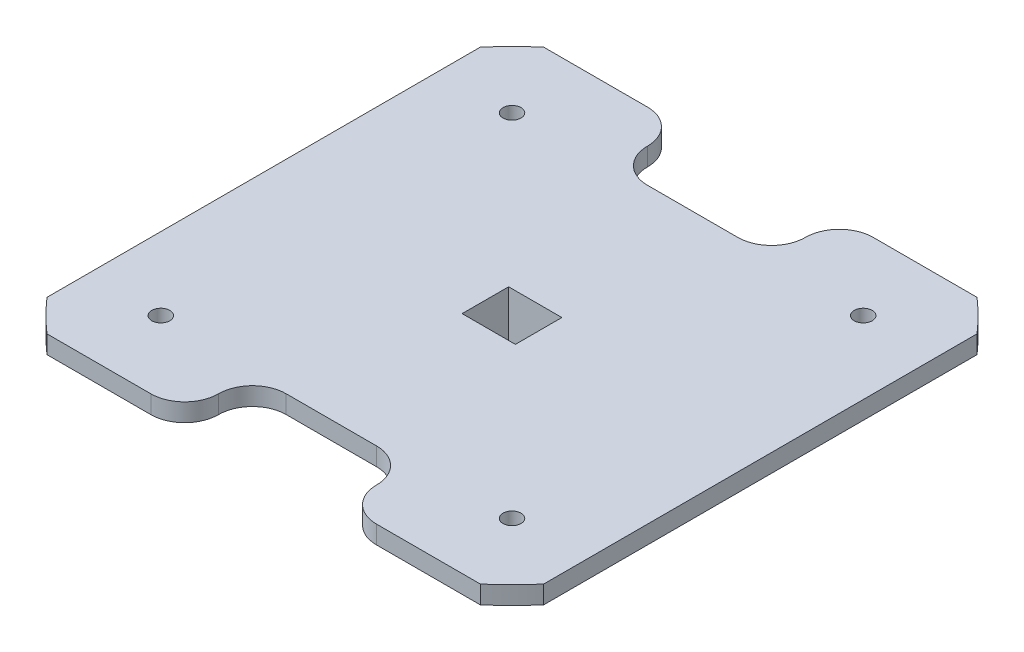
ISO-10303-21;
HEADER;
FILE_DESCRIPTION(('STEP AP214'),'2;1');
FILE_NAME('part.step','',(''),(''),'','','');
FILE_SCHEMA(('AUTOMOTIVE_DESIGN { 1 0 10303 214 1 1 1 1 }'));
ENDSEC;
DATA;
#1=APPLICATION_CONTEXT('core data for automotive mechanical design processes');
#2=APPLICATION_PROTOCOL_DEFINITION('international standard','automotive_design',2000,#1);
#3=PRODUCT_CONTEXT('',#1,'mechanical');
#4=PRODUCT('Part','Part','',(#3));
#5=PRODUCT_RELATED_PRODUCT_CATEGORY('part','',(#4));
#6=PRODUCT_DEFINITION_FORMATION('','',#4);
#7=PRODUCT_DEFINITION_CONTEXT('part definition',#1,'design');
#8=PRODUCT_DEFINITION('design','',#6,#7);
#9=PRODUCT_DEFINITION_SHAPE('','',#8);
#10=(LENGTH_UNIT() NAMED_UNIT(*) SI_UNIT(.MILLI.,.METRE.));
#11=(NAMED_UNIT(*) PLANE_ANGLE_UNIT() SI_UNIT($,.RADIAN.));
#12=(NAMED_UNIT(*) SI_UNIT($,.STERADIAN.) SOLID_ANGLE_UNIT());
#13=UNCERTAINTY_MEASURE_WITH_UNIT(LENGTH_MEASURE(1.E-05),#10,'distance_accuracy_value','');
#14=(GEOMETRIC_REPRESENTATION_CONTEXT(3) GLOBAL_UNCERTAINTY_ASSIGNED_CONTEXT((#13)) GLOBAL_UNIT_ASSIGNED_CONTEXT((#10,
#11,#12)) REPRESENTATION_CONTEXT('',''));
#15=CARTESIAN_POINT('',(0.,0.,0.));
#16=DIRECTION('',(0.,0.,1.));
#17=DIRECTION('',(1.,0.,0.));
#18=AXIS2_PLACEMENT_3D('',#15,#16,#17);
#19=CARTESIAN_POINT('',(0.,4.,0.));
#20=DIRECTION('',(0.,1.,0.));
#21=DIRECTION('',(0.,0.,1.));
#22=AXIS2_PLACEMENT_3D('',#19,#20,#21);
#23=PLANE('',#22);
#24=CARTESIAN_POINT('',(38.8908729652599,4.,-38.8908729652603));
#25=DIRECTION('',(0.,1.,0.));
#26=DIRECTION('',(0.,0.,1.));
#27=AXIS2_PLACEMENT_3D('',#24,#25,#26);
#28=CIRCLE('',#27,1.99999999999999);
#29=CARTESIAN_POINT('',(38.8908729652599,4.,-36.8908729652603));
#30=VERTEX_POINT('',#29);
#31=EDGE_CURVE('E272',#30,#30,#28,.T.);
#32=ORIENTED_EDGE('',*,*,#31,.F.);
#33=EDGE_LOOP('',(#32));
#34=FACE_BOUND('',#33,.T.);
#35=CARTESIAN_POINT('',(38.8908729652603,4.,38.8908729652599));
#36=DIRECTION('',(0.,1.,0.));
#37=DIRECTION('',(0.,0.,1.));
#38=AXIS2_PLACEMENT_3D('',#35,#36,#37);
#39=CIRCLE('',#38,1.99999999999999);
#40=CARTESIAN_POINT('',(38.8908729652603,4.,40.8908729652599));
#41=VERTEX_POINT('',#40);
#42=EDGE_CURVE('E482',#41,#41,#39,.T.);
#43=ORIENTED_EDGE('',*,*,#42,.F.);
#44=EDGE_LOOP('',(#43));
#45=FACE_BOUND('',#44,.T.);
#46=CARTESIAN_POINT('',(-38.8908729652599,4.,38.8908729652603));
#47=DIRECTION('',(0.,1.,0.));
#48=DIRECTION('',(0.,0.,1.));
#49=AXIS2_PLACEMENT_3D('',#46,#47,#48);
#50=CIRCLE('',#49,1.99999999999999);
#51=CARTESIAN_POINT('',(-38.8908729652599,4.,40.8908729652603));
#52=VERTEX_POINT('',#51);
#53=EDGE_CURVE('E474',#52,#52,#50,.T.);
#54=ORIENTED_EDGE('',*,*,#53,.F.);
#55=EDGE_LOOP('',(#54));
#56=FACE_BOUND('',#55,.T.);
#57=CARTESIAN_POINT('',(-38.8908729652603,4.,-38.8908729652599));
#58=DIRECTION('',(0.,1.,0.));
#59=DIRECTION('',(0.,0.,1.));
#60=AXIS2_PLACEMENT_3D('',#57,#58,#59);
#61=CIRCLE('',#60,1.99999999999999);
#62=CARTESIAN_POINT('',(-38.8908729652603,4.,-36.8908729652599));
#63=VERTEX_POINT('',#62);
#64=EDGE_CURVE('E466',#63,#63,#61,.T.);
#65=ORIENTED_EDGE('',*,*,#64,.F.);
#66=EDGE_LOOP('',(#65));
#67=FACE_BOUND('',#66,.T.);
#68=DIRECTION('',(-1.,0.,0.));
#69=VECTOR('',#68,1.);
#70=CARTESIAN_POINT('',(17.5,4.,-55.));
#71=LINE('',#70,#69);
#72=CARTESIAN_POINT('',(48.,4.,-55.));
#73=VERTEX_POINT('',#72);
#74=CARTESIAN_POINT('',(25.,4.,-55.));
#75=VERTEX_POINT('',#74);
#76=EDGE_CURVE('E450',#73,#75,#71,.T.);
#77=ORIENTED_EDGE('',*,*,#76,.T.);
#78=CARTESIAN_POINT('',(25.,4.,-47.5));
#79=DIRECTION('',(0.,1.,0.));
#80=DIRECTION('',(0.,0.,1.));
#81=AXIS2_PLACEMENT_3D('',#78,#79,#80);
#82=CIRCLE('',#81,7.5);
#83=CARTESIAN_POINT('',(17.5,4.,-47.5));
#84=VERTEX_POINT('',#83);
#85=EDGE_CURVE('E320',#75,#84,#82,.T.);
#86=ORIENTED_EDGE('',*,*,#85,.T.);
#87=CARTESIAN_POINT('',(10.,4.,-47.5));
#88=DIRECTION('',(0.,1.,0.));
#89=DIRECTION('',(0.,0.,1.));
#90=AXIS2_PLACEMENT_3D('',#87,#88,#89);
#91=CIRCLE('',#90,7.5);
#92=CARTESIAN_POINT('',(10.,4.,-40.));
#93=VERTEX_POINT('',#92);
#94=EDGE_CURVE('E290',#84,#93,#91,.F.);
#95=ORIENTED_EDGE('',*,*,#94,.T.);
#96=DIRECTION('',(-1.,0.,0.));
#97=VECTOR('',#96,1.);
#98=CARTESIAN_POINT('',(-17.5,4.,-40.));
#99=LINE('',#98,#97);
#100=CARTESIAN_POINT('',(-10.,4.,-40.));
#101=VERTEX_POINT('',#100);
#102=EDGE_CURVE('E446',#93,#101,#99,.T.);
#103=ORIENTED_EDGE('',*,*,#102,.T.);
#104=CARTESIAN_POINT('',(-10.,4.,-47.5));
#105=DIRECTION('',(0.,1.,0.));
#106=DIRECTION('',(0.,0.,1.));
#107=AXIS2_PLACEMENT_3D('',#104,#105,#106);
#108=CIRCLE('',#107,7.5);
#109=CARTESIAN_POINT('',(-17.5,4.,-47.5));
#110=VERTEX_POINT('',#109);
#111=EDGE_CURVE('E284',#101,#110,#108,.F.);
#112=ORIENTED_EDGE('',*,*,#111,.T.);
#113=CARTESIAN_POINT('',(-25.,4.,-47.5));
#114=DIRECTION('',(0.,1.,0.));
#115=DIRECTION('',(0.,0.,1.));
#116=AXIS2_PLACEMENT_3D('',#113,#114,#115);
#117=CIRCLE('',#116,7.5);
#118=CARTESIAN_POINT('',(-25.,4.,-55.));
#119=VERTEX_POINT('',#118);
#120=EDGE_CURVE('E323',#110,#119,#117,.T.);
#121=ORIENTED_EDGE('',*,*,#120,.T.);
#122=DIRECTION('',(-1.,0.,0.));
#123=VECTOR('',#122,1.);
#124=CARTESIAN_POINT('',(-48.,4.,-55.));
#125=LINE('',#124,#123);
#126=CARTESIAN_POINT('',(-48.,4.,-55.));
#127=VERTEX_POINT('',#126);
#128=EDGE_CURVE('E443',#119,#127,#125,.T.);
#129=ORIENTED_EDGE('',*,*,#128,.T.);
#130=CARTESIAN_POINT('',(0.,4.,0.));
#131=DIRECTION('',(0.,1.,0.));
#132=DIRECTION('',(0.,0.,1.));
#133=AXIS2_PLACEMENT_3D('',#130,#131,#132);
#134=CIRCLE('',#133,73.);
#135=CARTESIAN_POINT('',(-55.,4.,-48.));
#136=VERTEX_POINT('',#135);
#137=EDGE_CURVE('E440',#127,#136,#134,.T.);
#138=ORIENTED_EDGE('',*,*,#137,.T.);
#139=DIRECTION('',(0.,0.,1.));
#140=VECTOR('',#139,1.);
#141=CARTESIAN_POINT('',(-55.,4.,48.));
#142=LINE('',#141,#140);
#143=CARTESIAN_POINT('',(-55.,4.,48.));
#144=VERTEX_POINT('',#143);
#145=EDGE_CURVE('E437',#136,#144,#142,.T.);
#146=ORIENTED_EDGE('',*,*,#145,.T.);
#147=CARTESIAN_POINT('',(0.,4.,0.));
#148=DIRECTION('',(0.,1.,0.));
#149=DIRECTION('',(0.,0.,1.));
#150=AXIS2_PLACEMENT_3D('',#147,#148,#149);
#151=CIRCLE('',#150,73.);
#152=CARTESIAN_POINT('',(-48.,4.,55.));
#153=VERTEX_POINT('',#152);
#154=EDGE_CURVE('E434',#144,#153,#151,.T.);
#155=ORIENTED_EDGE('',*,*,#154,.T.);
#156=DIRECTION('',(1.,0.,0.));
#157=VECTOR('',#156,1.);
#158=CARTESIAN_POINT('',(-17.5,4.,55.));
#159=LINE('',#158,#157);
#160=CARTESIAN_POINT('',(-25.,4.,55.));
#161=VERTEX_POINT('',#160);
#162=EDGE_CURVE('E430',#153,#161,#159,.T.);
#163=ORIENTED_EDGE('',*,*,#162,.T.);
#164=CARTESIAN_POINT('',(-25.,4.,47.5));
#165=DIRECTION('',(0.,1.,0.));
#166=DIRECTION('',(0.,0.,1.));
#167=AXIS2_PLACEMENT_3D('',#164,#165,#166);
#168=CIRCLE('',#167,7.5);
#169=CARTESIAN_POINT('',(-17.5,4.,47.5));
#170=VERTEX_POINT('',#169);
#171=EDGE_CURVE('E326',#161,#170,#168,.T.);
#172=ORIENTED_EDGE('',*,*,#171,.T.);
#173=CARTESIAN_POINT('',(-10.,4.,47.5));
#174=DIRECTION('',(0.,1.,0.));
#175=DIRECTION('',(0.,0.,1.));
#176=AXIS2_PLACEMENT_3D('',#173,#174,#175);
#177=CIRCLE('',#176,7.5);
#178=CARTESIAN_POINT('',(-10.,4.,40.));
#179=VERTEX_POINT('',#178);
#180=EDGE_CURVE('E278',#170,#179,#177,.F.);
#181=ORIENTED_EDGE('',*,*,#180,.T.);
#182=DIRECTION('',(1.,0.,0.));
#183=VECTOR('',#182,1.);
#184=CARTESIAN_POINT('',(-17.5,4.,40.));
#185=LINE('',#184,#183);
#186=CARTESIAN_POINT('',(10.,4.,40.));
#187=VERTEX_POINT('',#186);
#188=EDGE_CURVE('E426',#179,#187,#185,.T.);
#189=ORIENTED_EDGE('',*,*,#188,.T.);
#190=CARTESIAN_POINT('',(10.,4.,47.5));
#191=DIRECTION('',(0.,1.,0.));
#192=DIRECTION('',(0.,0.,1.));
#193=AXIS2_PLACEMENT_3D('',#190,#191,#192);
#194=CIRCLE('',#193,7.5);
#195=CARTESIAN_POINT('',(17.5,4.,47.5));
#196=VERTEX_POINT('',#195);
#197=EDGE_CURVE('E248',#187,#196,#194,.F.);
#198=ORIENTED_EDGE('',*,*,#197,.T.);
#199=CARTESIAN_POINT('',(25.,4.,47.5));
#200=DIRECTION('',(0.,1.,0.));
#201=DIRECTION('',(0.,0.,1.));
#202=AXIS2_PLACEMENT_3D('',#199,#200,#201);
#203=CIRCLE('',#202,7.5);
#204=CARTESIAN_POINT('',(25.,4.,55.));
#205=VERTEX_POINT('',#204);
#206=EDGE_CURVE('E329',#196,#205,#203,.T.);
#207=ORIENTED_EDGE('',*,*,#206,.T.);
#208=DIRECTION('',(1.,0.,0.));
#209=VECTOR('',#208,1.);
#210=CARTESIAN_POINT('',(48.,4.,55.));
#211=LINE('',#210,#209);
#212=CARTESIAN_POINT('',(48.,4.,55.));
#213=VERTEX_POINT('',#212);
#214=EDGE_CURVE('E380',#205,#213,#211,.T.);
#215=ORIENTED_EDGE('',*,*,#214,.T.);
#216=CARTESIAN_POINT('',(0.,4.,0.));
#217=DIRECTION('',(0.,1.,0.));
#218=DIRECTION('',(0.,0.,1.));
#219=AXIS2_PLACEMENT_3D('',#216,#217,#218);
#220=CIRCLE('',#219,73.);
#221=CARTESIAN_POINT('',(55.,4.,48.));
#222=VERTEX_POINT('',#221);
#223=EDGE_CURVE('E384',#213,#222,#220,.T.);
#224=ORIENTED_EDGE('',*,*,#223,.T.);
#225=DIRECTION('',(0.,0.,-1.));
#226=VECTOR('',#225,1.);
#227=CARTESIAN_POINT('',(55.,4.,-48.));
#228=LINE('',#227,#226);
#229=CARTESIAN_POINT('',(55.,4.,-48.));
#230=VERTEX_POINT('',#229);
#231=EDGE_CURVE('E457',#222,#230,#228,.T.);
#232=ORIENTED_EDGE('',*,*,#231,.T.);
#233=CARTESIAN_POINT('',(0.,4.,0.));
#234=DIRECTION('',(0.,1.,0.));
#235=DIRECTION('',(0.,0.,1.));
#236=AXIS2_PLACEMENT_3D('',#233,#234,#235);
#237=CIRCLE('',#236,73.);
#238=EDGE_CURVE('E454',#230,#73,#237,.T.);
#239=ORIENTED_EDGE('',*,*,#238,.T.);
#240=EDGE_LOOP('',(#77,#86,#95,#103,#112,#121,#129,#138,#146,#155,#163,#172,#181,#189,#198,#207,
#215,#224,#232,#239));
#241=FACE_BOUND('',#240,.T.);
#242=DIRECTION('',(-1.,0.,0.));
#243=VECTOR('',#242,1.);
#244=CARTESIAN_POINT('',(0.,4.,5.15));
#245=LINE('',#244,#243);
#246=CARTESIAN_POINT('',(5.9,4.,5.15));
#247=VERTEX_POINT('',#246);
#248=CARTESIAN_POINT('',(-5.9,4.,5.15));
#249=VERTEX_POINT('',#248);
#250=EDGE_CURVE('E55',#247,#249,#245,.T.);
#251=ORIENTED_EDGE('',*,*,#250,.T.);
#252=DIRECTION('',(0.,0.,-1.));
#253=VECTOR('',#252,1.);
#254=CARTESIAN_POINT('',(-5.9,4.,0.));
#255=LINE('',#254,#253);
#256=CARTESIAN_POINT('',(-5.9,4.,-5.15));
#257=VERTEX_POINT('',#256);
#258=EDGE_CURVE('E11',#249,#257,#255,.T.);
#259=ORIENTED_EDGE('',*,*,#258,.T.);
#260=DIRECTION('',(-1.,0.,0.));
#261=VECTOR('',#260,1.);
#262=CARTESIAN_POINT('',(0.,4.,-5.15));
#263=LINE('',#262,#261);
#264=CARTESIAN_POINT('',(5.9,4.,-5.15));
#265=VERTEX_POINT('',#264);
#266=EDGE_CURVE('E243',#265,#257,#263,.T.);
#267=ORIENTED_EDGE('',*,*,#266,.F.);
#268=DIRECTION('',(0.,0.,-1.));
#269=VECTOR('',#268,1.);
#270=CARTESIAN_POINT('',(5.9,4.,0.));
#271=LINE('',#270,#269);
#272=EDGE_CURVE('E247',#247,#265,#271,.T.);
#273=ORIENTED_EDGE('',*,*,#272,.F.);
#274=EDGE_LOOP('',(#251,#259,#267,#273));
#275=FACE_BOUND('',#274,.T.);
#276=ADVANCED_FACE('F47',(#34,#45,#56,#67,#241,#275),#23,.T.);
#277=CARTESIAN_POINT('',(0.,0.,0.));
#278=DIRECTION('',(0.,1.,0.));
#279=DIRECTION('',(0.,0.,1.));
#280=AXIS2_PLACEMENT_3D('',#277,#278,#279);
#281=PLANE('',#280);
#282=CARTESIAN_POINT('',(38.8908729652599,0.,-38.8908729652603));
#283=DIRECTION('',(0.,1.,0.));
#284=DIRECTION('',(0.,0.,1.));
#285=AXIS2_PLACEMENT_3D('',#282,#283,#284);
#286=CIRCLE('',#285,2.);
#287=CARTESIAN_POINT('',(38.8908729652599,0.,-36.8908729652603));
#288=VERTEX_POINT('',#287);
#289=EDGE_CURVE('E486',#288,#288,#286,.T.);
#290=ORIENTED_EDGE('',*,*,#289,.T.);
#291=EDGE_LOOP('',(#290));
#292=FACE_BOUND('',#291,.T.);
#293=CARTESIAN_POINT('',(38.8908729652603,0.,38.8908729652599));
#294=DIRECTION('',(0.,1.,0.));
#295=DIRECTION('',(0.,0.,1.));
#296=AXIS2_PLACEMENT_3D('',#293,#294,#295);
#297=CIRCLE('',#296,2.);
#298=CARTESIAN_POINT('',(38.8908729652603,0.,40.8908729652599));
#299=VERTEX_POINT('',#298);
#300=EDGE_CURVE('E478',#299,#299,#297,.T.);
#301=ORIENTED_EDGE('',*,*,#300,.T.);
#302=EDGE_LOOP('',(#301));
#303=FACE_BOUND('',#302,.T.);
#304=CARTESIAN_POINT('',(-38.8908729652599,0.,38.8908729652603));
#305=DIRECTION('',(0.,1.,0.));
#306=DIRECTION('',(0.,0.,1.));
#307=AXIS2_PLACEMENT_3D('',#304,#305,#306);
#308=CIRCLE('',#307,2.);
#309=CARTESIAN_POINT('',(-38.8908729652599,0.,40.8908729652603));
#310=VERTEX_POINT('',#309);
#311=EDGE_CURVE('E470',#310,#310,#308,.T.);
#312=ORIENTED_EDGE('',*,*,#311,.T.);
#313=EDGE_LOOP('',(#312));
#314=FACE_BOUND('',#313,.T.);
#315=CARTESIAN_POINT('',(-38.8908729652603,0.,-38.8908729652599));
#316=DIRECTION('',(0.,1.,0.));
#317=DIRECTION('',(0.,0.,1.));
#318=AXIS2_PLACEMENT_3D('',#315,#316,#317);
#319=CIRCLE('',#318,2.);
#320=CARTESIAN_POINT('',(-38.8908729652603,0.,-36.8908729652599));
#321=VERTEX_POINT('',#320);
#322=EDGE_CURVE('E423',#321,#321,#319,.T.);
#323=ORIENTED_EDGE('',*,*,#322,.T.);
#324=EDGE_LOOP('',(#323));
#325=FACE_BOUND('',#324,.T.);
#326=DIRECTION('',(-1.,0.,0.));
#327=VECTOR('',#326,1.);
#328=CARTESIAN_POINT('',(-17.5,0.,-40.));
#329=LINE('',#328,#327);
#330=CARTESIAN_POINT('',(10.,0.,-40.));
#331=VERTEX_POINT('',#330);
#332=CARTESIAN_POINT('',(-10.,0.,-40.));
#333=VERTEX_POINT('',#332);
#334=EDGE_CURVE('E405',#331,#333,#329,.T.);
#335=ORIENTED_EDGE('',*,*,#334,.F.);
#336=CARTESIAN_POINT('',(10.,0.,-47.5));
#337=DIRECTION('',(0.,1.,0.));
#338=DIRECTION('',(0.,0.,1.));
#339=AXIS2_PLACEMENT_3D('',#336,#337,#338);
#340=CIRCLE('',#339,7.5);
#341=CARTESIAN_POINT('',(17.5,0.,-47.5));
#342=VERTEX_POINT('',#341);
#343=EDGE_CURVE('E293',#331,#342,#340,.T.);
#344=ORIENTED_EDGE('',*,*,#343,.T.);
#345=CARTESIAN_POINT('',(25.,0.,-47.5));
#346=DIRECTION('',(0.,1.,0.));
#347=DIRECTION('',(0.,0.,1.));
#348=AXIS2_PLACEMENT_3D('',#345,#346,#347);
#349=CIRCLE('',#348,7.5);
#350=CARTESIAN_POINT('',(25.,0.,-55.));
#351=VERTEX_POINT('',#350);
#352=EDGE_CURVE('E336',#342,#351,#349,.F.);
#353=ORIENTED_EDGE('',*,*,#352,.T.);
#354=DIRECTION('',(-1.,0.,0.));
#355=VECTOR('',#354,1.);
#356=CARTESIAN_POINT('',(17.5,0.,-55.));
#357=LINE('',#356,#355);
#358=CARTESIAN_POINT('',(48.,0.,-55.));
#359=VERTEX_POINT('',#358);
#360=EDGE_CURVE('E409',#359,#351,#357,.T.);
#361=ORIENTED_EDGE('',*,*,#360,.F.);
#362=CARTESIAN_POINT('',(0.,0.,0.));
#363=DIRECTION('',(0.,1.,0.));
#364=DIRECTION('',(0.,0.,1.));
#365=AXIS2_PLACEMENT_3D('',#362,#363,#364);
#366=CIRCLE('',#365,73.);
#367=CARTESIAN_POINT('',(55.,0.,-48.));
#368=VERTEX_POINT('',#367);
#369=EDGE_CURVE('E413',#368,#359,#366,.T.);
#370=ORIENTED_EDGE('',*,*,#369,.F.);
#371=DIRECTION('',(0.,0.,-1.));
#372=VECTOR('',#371,1.);
#373=CARTESIAN_POINT('',(55.,0.,-48.));
#374=LINE('',#373,#372);
#375=CARTESIAN_POINT('',(55.,0.,48.));
#376=VERTEX_POINT('',#375);
#377=EDGE_CURVE('E416',#376,#368,#374,.T.);
#378=ORIENTED_EDGE('',*,*,#377,.F.);
#379=CARTESIAN_POINT('',(0.,0.,0.));
#380=DIRECTION('',(0.,1.,0.));
#381=DIRECTION('',(0.,0.,1.));
#382=AXIS2_PLACEMENT_3D('',#379,#380,#381);
#383=CIRCLE('',#382,73.);
#384=CARTESIAN_POINT('',(48.,0.,55.));
#385=VERTEX_POINT('',#384);
#386=EDGE_CURVE('E419',#385,#376,#383,.T.);
#387=ORIENTED_EDGE('',*,*,#386,.F.);
#388=DIRECTION('',(1.,0.,0.));
#389=VECTOR('',#388,1.);
#390=CARTESIAN_POINT('',(48.,0.,55.));
#391=LINE('',#390,#389);
#392=CARTESIAN_POINT('',(25.,0.,55.));
#393=VERTEX_POINT('',#392);
#394=EDGE_CURVE('E381',#393,#385,#391,.T.);
#395=ORIENTED_EDGE('',*,*,#394,.F.);
#396=CARTESIAN_POINT('',(25.,0.,47.5));
#397=DIRECTION('',(0.,1.,0.));
#398=DIRECTION('',(0.,0.,1.));
#399=AXIS2_PLACEMENT_3D('',#396,#397,#398);
#400=CIRCLE('',#399,7.5);
#401=CARTESIAN_POINT('',(17.5,0.,47.5));
#402=VERTEX_POINT('',#401);
#403=EDGE_CURVE('E345',#393,#402,#400,.F.);
#404=ORIENTED_EDGE('',*,*,#403,.T.);
#405=CARTESIAN_POINT('',(10.,0.,47.5));
#406=DIRECTION('',(0.,1.,0.));
#407=DIRECTION('',(0.,0.,1.));
#408=AXIS2_PLACEMENT_3D('',#405,#406,#407);
#409=CIRCLE('',#408,7.5);
#410=CARTESIAN_POINT('',(10.,0.,40.));
#411=VERTEX_POINT('',#410);
#412=EDGE_CURVE('E275',#402,#411,#409,.T.);
#413=ORIENTED_EDGE('',*,*,#412,.T.);
#414=DIRECTION('',(1.,0.,0.));
#415=VECTOR('',#414,1.);
#416=CARTESIAN_POINT('',(-17.5,0.,40.));
#417=LINE('',#416,#415);
#418=CARTESIAN_POINT('',(-10.,0.,40.));
#419=VERTEX_POINT('',#418);
#420=EDGE_CURVE('E385',#419,#411,#417,.T.);
#421=ORIENTED_EDGE('',*,*,#420,.F.);
#422=CARTESIAN_POINT('',(-10.,0.,47.5));
#423=DIRECTION('',(0.,1.,0.));
#424=DIRECTION('',(0.,0.,1.));
#425=AXIS2_PLACEMENT_3D('',#422,#423,#424);
#426=CIRCLE('',#425,7.5);
#427=CARTESIAN_POINT('',(-17.5,0.,47.5));
#428=VERTEX_POINT('',#427);
#429=EDGE_CURVE('E281',#419,#428,#426,.T.);
#430=ORIENTED_EDGE('',*,*,#429,.T.);
#431=CARTESIAN_POINT('',(-25.,0.,47.5));
#432=DIRECTION('',(0.,1.,0.));
#433=DIRECTION('',(0.,0.,1.));
#434=AXIS2_PLACEMENT_3D('',#431,#432,#433);
#435=CIRCLE('',#434,7.5);
#436=CARTESIAN_POINT('',(-25.,0.,55.));
#437=VERTEX_POINT('',#436);
#438=EDGE_CURVE('E342',#428,#437,#435,.F.);
#439=ORIENTED_EDGE('',*,*,#438,.T.);
#440=DIRECTION('',(1.,0.,0.));
#441=VECTOR('',#440,1.);
#442=CARTESIAN_POINT('',(-17.5,0.,55.));
#443=LINE('',#442,#441);
#444=CARTESIAN_POINT('',(-48.,0.,55.));
#445=VERTEX_POINT('',#444);
#446=EDGE_CURVE('E389',#445,#437,#443,.T.);
#447=ORIENTED_EDGE('',*,*,#446,.F.);
#448=CARTESIAN_POINT('',(0.,0.,0.));
#449=DIRECTION('',(0.,1.,0.));
#450=DIRECTION('',(0.,0.,1.));
#451=AXIS2_PLACEMENT_3D('',#448,#449,#450);
#452=CIRCLE('',#451,73.);
#453=CARTESIAN_POINT('',(-55.,0.,48.));
#454=VERTEX_POINT('',#453);
#455=EDGE_CURVE('E393',#454,#445,#452,.T.);
#456=ORIENTED_EDGE('',*,*,#455,.F.);
#457=DIRECTION('',(0.,0.,1.));
#458=VECTOR('',#457,1.);
#459=CARTESIAN_POINT('',(-55.,0.,48.));
#460=LINE('',#459,#458);
#461=CARTESIAN_POINT('',(-55.,0.,-48.));
#462=VERTEX_POINT('',#461);
#463=EDGE_CURVE('E396',#462,#454,#460,.T.);
#464=ORIENTED_EDGE('',*,*,#463,.F.);
#465=CARTESIAN_POINT('',(0.,0.,0.));
#466=DIRECTION('',(0.,1.,0.));
#467=DIRECTION('',(0.,0.,1.));
#468=AXIS2_PLACEMENT_3D('',#465,#466,#467);
#469=CIRCLE('',#468,73.);
#470=CARTESIAN_POINT('',(-48.,0.,-55.));
#471=VERTEX_POINT('',#470);
#472=EDGE_CURVE('E399',#471,#462,#469,.T.);
#473=ORIENTED_EDGE('',*,*,#472,.F.);
#474=DIRECTION('',(-1.,0.,0.));
#475=VECTOR('',#474,1.);
#476=CARTESIAN_POINT('',(-48.,0.,-55.));
#477=LINE('',#476,#475);
#478=CARTESIAN_POINT('',(-25.,0.,-55.));
#479=VERTEX_POINT('',#478);
#480=EDGE_CURVE('E402',#479,#471,#477,.T.);
#481=ORIENTED_EDGE('',*,*,#480,.F.);
#482=CARTESIAN_POINT('',(-25.,0.,-47.5));
#483=DIRECTION('',(0.,1.,0.));
#484=DIRECTION('',(0.,0.,1.));
#485=AXIS2_PLACEMENT_3D('',#482,#483,#484);
#486=CIRCLE('',#485,7.5);
#487=CARTESIAN_POINT('',(-17.5,0.,-47.5));
#488=VERTEX_POINT('',#487);
#489=EDGE_CURVE('E339',#479,#488,#486,.F.);
#490=ORIENTED_EDGE('',*,*,#489,.T.);
#491=CARTESIAN_POINT('',(-10.,0.,-47.5));
#492=DIRECTION('',(0.,1.,0.));
#493=DIRECTION('',(0.,0.,1.));
#494=AXIS2_PLACEMENT_3D('',#491,#492,#493);
#495=CIRCLE('',#494,7.5);
#496=EDGE_CURVE('E287',#488,#333,#495,.T.);
#497=ORIENTED_EDGE('',*,*,#496,.T.);
#498=EDGE_LOOP('',(#335,#344,#353,#361,#370,#378,#387,#395,#404,#413,#421,#430,#439,#447,#456,
#464,#473,#481,#490,#497));
#499=FACE_BOUND('',#498,.T.);
#500=DIRECTION('',(0.,0.,-1.));
#501=VECTOR('',#500,1.);
#502=CARTESIAN_POINT('',(-10.9,0.,-10.15));
#503=LINE('',#502,#501);
#504=CARTESIAN_POINT('',(-10.9,0.,10.15));
#505=VERTEX_POINT('',#504);
#506=CARTESIAN_POINT('',(-10.9,0.,-10.15));
#507=VERTEX_POINT('',#506);
#508=EDGE_CURVE('E512',#505,#507,#503,.T.);
#509=ORIENTED_EDGE('',*,*,#508,.F.);
#510=DIRECTION('',(-1.,0.,0.));
#511=VECTOR('',#510,1.);
#512=CARTESIAN_POINT('',(-10.9,0.,10.15));
#513=LINE('',#512,#511);
#514=CARTESIAN_POINT('',(10.9,0.,10.15));
#515=VERTEX_POINT('',#514);
#516=EDGE_CURVE('E504',#515,#505,#513,.T.);
#517=ORIENTED_EDGE('',*,*,#516,.F.);
#518=DIRECTION('',(0.,0.,1.));
#519=VECTOR('',#518,1.);
#520=CARTESIAN_POINT('',(10.9,0.,-10.15));
#521=LINE('',#520,#519);
#522=CARTESIAN_POINT('',(10.9,0.,-10.15));
#523=VERTEX_POINT('',#522);
#524=EDGE_CURVE('E508',#523,#515,#521,.T.);
#525=ORIENTED_EDGE('',*,*,#524,.F.);
#526=DIRECTION('',(1.,0.,0.));
#527=VECTOR('',#526,1.);
#528=CARTESIAN_POINT('',(-10.9,0.,-10.15));
#529=LINE('',#528,#527);
#530=EDGE_CURVE('E70',#507,#523,#529,.T.);
#531=ORIENTED_EDGE('',*,*,#530,.F.);
#532=EDGE_LOOP('',(#509,#517,#525,#531));
#533=FACE_BOUND('',#532,.T.);
#534=ADVANCED_FACE('F561',(#292,#303,#314,#325,#499,#533),#281,.F.);
#535=CARTESIAN_POINT('',(0.,4.,0.));
#536=DIRECTION('',(0.,-1.,0.));
#537=DIRECTION('',(0.,0.,-1.));
#538=AXIS2_PLACEMENT_3D('',#535,#536,#537);
#539=CYLINDRICAL_SURFACE('',#538,73.);
#540=ORIENTED_EDGE('',*,*,#386,.T.);
#541=DIRECTION('',(0.,-1.,0.));
#542=VECTOR('',#541,1.);
#543=CARTESIAN_POINT('',(55.,4.,48.));
#544=LINE('',#543,#542);
#545=EDGE_CURVE('E348',#222,#376,#544,.T.);
#546=ORIENTED_EDGE('',*,*,#545,.F.);
#547=ORIENTED_EDGE('',*,*,#223,.F.);
#548=DIRECTION('',(0.,-1.,0.));
#549=VECTOR('',#548,1.);
#550=CARTESIAN_POINT('',(48.,4.,55.));
#551=LINE('',#550,#549);
#552=EDGE_CURVE('E376',#213,#385,#551,.T.);
#553=ORIENTED_EDGE('',*,*,#552,.T.);
#554=EDGE_LOOP('',(#540,#546,#547,#553));
#555=FACE_BOUND('',#554,.T.);
#556=ADVANCED_FACE('F584',(#555),#539,.T.);
#557=CARTESIAN_POINT('',(55.,4.,-48.));
#558=DIRECTION('',(-1.,0.,0.));
#559=DIRECTION('',(0.,0.,1.));
#560=AXIS2_PLACEMENT_3D('',#557,#558,#559);
#561=PLANE('',#560);
#562=ORIENTED_EDGE('',*,*,#377,.T.);
#563=DIRECTION('',(0.,-1.,0.));
#564=VECTOR('',#563,1.);
#565=CARTESIAN_POINT('',(55.,4.,-48.));
#566=LINE('',#565,#564);
#567=EDGE_CURVE('E352',#230,#368,#566,.T.);
#568=ORIENTED_EDGE('',*,*,#567,.F.);
#569=ORIENTED_EDGE('',*,*,#231,.F.);
#570=ORIENTED_EDGE('',*,*,#545,.T.);
#571=EDGE_LOOP('',(#562,#568,#569,#570));
#572=FACE_BOUND('',#571,.T.);
#573=ADVANCED_FACE('F632',(#572),#561,.F.);
#574=CARTESIAN_POINT('',(0.,4.,0.));
#575=DIRECTION('',(0.,-1.,0.));
#576=DIRECTION('',(0.,0.,-1.));
#577=AXIS2_PLACEMENT_3D('',#574,#575,#576);
#578=CYLINDRICAL_SURFACE('',#577,73.);
#579=ORIENTED_EDGE('',*,*,#369,.T.);
#580=DIRECTION('',(0.,-1.,0.));
#581=VECTOR('',#580,1.);
#582=CARTESIAN_POINT('',(48.,4.,-55.));
#583=LINE('',#582,#581);
#584=EDGE_CURVE('E356',#73,#359,#583,.T.);
#585=ORIENTED_EDGE('',*,*,#584,.F.);
#586=ORIENTED_EDGE('',*,*,#238,.F.);
#587=ORIENTED_EDGE('',*,*,#567,.T.);
#588=EDGE_LOOP('',(#579,#585,#586,#587));
#589=FACE_BOUND('',#588,.T.);
#590=ADVANCED_FACE('F628',(#589),#578,.T.);
#591=CARTESIAN_POINT('',(17.5,4.,-55.));
#592=DIRECTION('',(0.,0.,1.));
#593=DIRECTION('',(1.,0.,0.));
#594=AXIS2_PLACEMENT_3D('',#591,#592,#593);
#595=PLANE('',#594);
#596=ORIENTED_EDGE('',*,*,#360,.T.);
#597=DIRECTION('',(0.,-1.,0.));
#598=VECTOR('',#597,1.);
#599=CARTESIAN_POINT('',(25.,4.,-55.));
#600=LINE('',#599,#598);
#601=EDGE_CURVE('E332',#351,#75,#600,.F.);
#602=ORIENTED_EDGE('',*,*,#601,.T.);
#603=ORIENTED_EDGE('',*,*,#76,.F.);
#604=ORIENTED_EDGE('',*,*,#584,.T.);
#605=EDGE_LOOP('',(#596,#602,#603,#604));
#606=FACE_BOUND('',#605,.T.);
#607=ADVANCED_FACE('F624',(#606),#595,.F.);
#608=CARTESIAN_POINT('',(-17.5,4.,-40.));
#609=DIRECTION('',(0.,0.,1.));
#610=DIRECTION('',(1.,0.,0.));
#611=AXIS2_PLACEMENT_3D('',#608,#609,#610);
#612=PLANE('',#611);
#613=ORIENTED_EDGE('',*,*,#102,.F.);
#614=DIRECTION('',(0.,-1.,0.));
#615=VECTOR('',#614,1.);
#616=CARTESIAN_POINT('',(10.,0.,-40.));
#617=LINE('',#616,#615);
#618=EDGE_CURVE('E314',#93,#331,#617,.T.);
#619=ORIENTED_EDGE('',*,*,#618,.T.);
#620=ORIENTED_EDGE('',*,*,#334,.T.);
#621=DIRECTION('',(0.,-1.,0.));
#622=VECTOR('',#621,1.);
#623=CARTESIAN_POINT('',(-10.,4.,-40.));
#624=LINE('',#623,#622);
#625=EDGE_CURVE('E317',#333,#101,#624,.F.);
#626=ORIENTED_EDGE('',*,*,#625,.T.);
#627=EDGE_LOOP('',(#613,#619,#620,#626));
#628=FACE_BOUND('',#627,.T.);
#629=ADVANCED_FACE('F620',(#628),#612,.F.);
#630=CARTESIAN_POINT('',(-48.,4.,-55.));
#631=DIRECTION('',(0.,0.,1.));
#632=DIRECTION('',(1.,0.,0.));
#633=AXIS2_PLACEMENT_3D('',#630,#631,#632);
#634=PLANE('',#633);
#635=ORIENTED_EDGE('',*,*,#128,.F.);
#636=DIRECTION('',(0.,-1.,0.));
#637=VECTOR('',#636,1.);
#638=CARTESIAN_POINT('',(-25.,4.,-55.));
#639=LINE('',#638,#637);
#640=EDGE_CURVE('E310',#119,#479,#639,.T.);
#641=ORIENTED_EDGE('',*,*,#640,.T.);
#642=ORIENTED_EDGE('',*,*,#480,.T.);
#643=DIRECTION('',(0.,-1.,0.));
#644=VECTOR('',#643,1.);
#645=CARTESIAN_POINT('',(-48.,4.,-55.));
#646=LINE('',#645,#644);
#647=EDGE_CURVE('E360',#127,#471,#646,.T.);
#648=ORIENTED_EDGE('',*,*,#647,.F.);
#649=EDGE_LOOP('',(#635,#641,#642,#648));
#650=FACE_BOUND('',#649,.T.);
#651=ADVANCED_FACE('F616',(#650),#634,.F.);
#652=CARTESIAN_POINT('',(0.,4.,0.));
#653=DIRECTION('',(0.,-1.,0.));
#654=DIRECTION('',(0.,0.,-1.));
#655=AXIS2_PLACEMENT_3D('',#652,#653,#654);
#656=CYLINDRICAL_SURFACE('',#655,73.);
#657=ORIENTED_EDGE('',*,*,#472,.T.);
#658=DIRECTION('',(0.,-1.,0.));
#659=VECTOR('',#658,1.);
#660=CARTESIAN_POINT('',(-55.,4.,-48.));
#661=LINE('',#660,#659);
#662=EDGE_CURVE('E364',#136,#462,#661,.T.);
#663=ORIENTED_EDGE('',*,*,#662,.F.);
#664=ORIENTED_EDGE('',*,*,#137,.F.);
#665=ORIENTED_EDGE('',*,*,#647,.T.);
#666=EDGE_LOOP('',(#657,#663,#664,#665));
#667=FACE_BOUND('',#666,.T.);
#668=ADVANCED_FACE('F612',(#667),#656,.T.);
#669=CARTESIAN_POINT('',(-55.,4.,48.));
#670=DIRECTION('',(1.,0.,0.));
#671=DIRECTION('',(0.,0.,-1.));
#672=AXIS2_PLACEMENT_3D('',#669,#670,#671);
#673=PLANE('',#672);
#674=ORIENTED_EDGE('',*,*,#463,.T.);
#675=DIRECTION('',(0.,-1.,0.));
#676=VECTOR('',#675,1.);
#677=CARTESIAN_POINT('',(-55.,4.,48.));
#678=LINE('',#677,#676);
#679=EDGE_CURVE('E368',#144,#454,#678,.T.);
#680=ORIENTED_EDGE('',*,*,#679,.F.);
#681=ORIENTED_EDGE('',*,*,#145,.F.);
#682=ORIENTED_EDGE('',*,*,#662,.T.);
#683=EDGE_LOOP('',(#674,#680,#681,#682));
#684=FACE_BOUND('',#683,.T.);
#685=ADVANCED_FACE('F608',(#684),#673,.F.);
#686=CARTESIAN_POINT('',(0.,4.,0.));
#687=DIRECTION('',(0.,-1.,0.));
#688=DIRECTION('',(0.,0.,-1.));
#689=AXIS2_PLACEMENT_3D('',#686,#687,#688);
#690=CYLINDRICAL_SURFACE('',#689,73.);
#691=ORIENTED_EDGE('',*,*,#455,.T.);
#692=DIRECTION('',(0.,-1.,0.));
#693=VECTOR('',#692,1.);
#694=CARTESIAN_POINT('',(-48.,4.,55.));
#695=LINE('',#694,#693);
#696=EDGE_CURVE('E372',#153,#445,#695,.T.);
#697=ORIENTED_EDGE('',*,*,#696,.F.);
#698=ORIENTED_EDGE('',*,*,#154,.F.);
#699=ORIENTED_EDGE('',*,*,#679,.T.);
#700=EDGE_LOOP('',(#691,#697,#698,#699));
#701=FACE_BOUND('',#700,.T.);
#702=ADVANCED_FACE('F604',(#701),#690,.T.);
#703=CARTESIAN_POINT('',(-17.5,4.,55.));
#704=DIRECTION('',(0.,0.,-1.));
#705=DIRECTION('',(-1.,0.,0.));
#706=AXIS2_PLACEMENT_3D('',#703,#704,#705);
#707=PLANE('',#706);
#708=ORIENTED_EDGE('',*,*,#446,.T.);
#709=DIRECTION('',(0.,-1.,0.));
#710=VECTOR('',#709,1.);
#711=CARTESIAN_POINT('',(-25.,4.,55.));
#712=LINE('',#711,#710);
#713=EDGE_CURVE('E306',#437,#161,#712,.F.);
#714=ORIENTED_EDGE('',*,*,#713,.T.);
#715=ORIENTED_EDGE('',*,*,#162,.F.);
#716=ORIENTED_EDGE('',*,*,#696,.T.);
#717=EDGE_LOOP('',(#708,#714,#715,#716));
#718=FACE_BOUND('',#717,.T.);
#719=ADVANCED_FACE('F600',(#718),#707,.F.);
#720=CARTESIAN_POINT('',(-17.5,4.,40.));
#721=DIRECTION('',(0.,0.,-1.));
#722=DIRECTION('',(-1.,0.,0.));
#723=AXIS2_PLACEMENT_3D('',#720,#721,#722);
#724=PLANE('',#723);
#725=ORIENTED_EDGE('',*,*,#188,.F.);
#726=DIRECTION('',(0.,-1.,0.));
#727=VECTOR('',#726,1.);
#728=CARTESIAN_POINT('',(-10.,0.,40.));
#729=LINE('',#728,#727);
#730=EDGE_CURVE('E300',#179,#419,#729,.T.);
#731=ORIENTED_EDGE('',*,*,#730,.T.);
#732=ORIENTED_EDGE('',*,*,#420,.T.);
#733=DIRECTION('',(0.,-1.,0.));
#734=VECTOR('',#733,1.);
#735=CARTESIAN_POINT('',(10.,4.,40.));
#736=LINE('',#735,#734);
#737=EDGE_CURVE('E303',#411,#187,#736,.F.);
#738=ORIENTED_EDGE('',*,*,#737,.T.);
#739=EDGE_LOOP('',(#725,#731,#732,#738));
#740=FACE_BOUND('',#739,.T.);
#741=ADVANCED_FACE('F596',(#740),#724,.F.);
#742=CARTESIAN_POINT('',(48.,4.,55.));
#743=DIRECTION('',(0.,0.,-1.));
#744=DIRECTION('',(-1.,0.,0.));
#745=AXIS2_PLACEMENT_3D('',#742,#743,#744);
#746=PLANE('',#745);
#747=ORIENTED_EDGE('',*,*,#214,.F.);
#748=DIRECTION('',(0.,-1.,0.));
#749=VECTOR('',#748,1.);
#750=CARTESIAN_POINT('',(25.,4.,55.));
#751=LINE('',#750,#749);
#752=EDGE_CURVE('E296',#205,#393,#751,.T.);
#753=ORIENTED_EDGE('',*,*,#752,.T.);
#754=ORIENTED_EDGE('',*,*,#394,.T.);
#755=ORIENTED_EDGE('',*,*,#552,.F.);
#756=EDGE_LOOP('',(#747,#753,#754,#755));
#757=FACE_BOUND('',#756,.T.);
#758=ADVANCED_FACE('F593',(#757),#746,.F.);
#759=CARTESIAN_POINT('',(-38.8908729652603,4.,-38.8908729652599));
#760=DIRECTION('',(0.,1.,0.));
#761=DIRECTION('',(0.,0.,1.));
#762=AXIS2_PLACEMENT_3D('',#759,#760,#761);
#763=CYLINDRICAL_SURFACE('',#762,1.99999999999999);
#764=ORIENTED_EDGE('',*,*,#322,.F.);
#765=EDGE_LOOP('',(#764));
#766=FACE_BOUND('',#765,.T.);
#767=ORIENTED_EDGE('',*,*,#64,.T.);
#768=EDGE_LOOP('',(#767));
#769=FACE_BOUND('',#768,.T.);
#770=ADVANCED_FACE('F590',(#766,#769),#763,.F.);
#771=CARTESIAN_POINT('',(-38.8908729652599,4.,38.8908729652603));
#772=DIRECTION('',(0.,1.,0.));
#773=DIRECTION('',(0.,0.,1.));
#774=AXIS2_PLACEMENT_3D('',#771,#772,#773);
#775=CYLINDRICAL_SURFACE('',#774,1.99999999999999);
#776=ORIENTED_EDGE('',*,*,#311,.F.);
#777=EDGE_LOOP('',(#776));
#778=FACE_BOUND('',#777,.T.);
#779=ORIENTED_EDGE('',*,*,#53,.T.);
#780=EDGE_LOOP('',(#779));
#781=FACE_BOUND('',#780,.T.);
#782=ADVANCED_FACE('F761',(#778,#781),#775,.F.);
#783=CARTESIAN_POINT('',(38.8908729652603,4.,38.8908729652599));
#784=DIRECTION('',(0.,1.,0.));
#785=DIRECTION('',(0.,0.,1.));
#786=AXIS2_PLACEMENT_3D('',#783,#784,#785);
#787=CYLINDRICAL_SURFACE('',#786,1.99999999999999);
#788=ORIENTED_EDGE('',*,*,#300,.F.);
#789=EDGE_LOOP('',(#788));
#790=FACE_BOUND('',#789,.T.);
#791=ORIENTED_EDGE('',*,*,#42,.T.);
#792=EDGE_LOOP('',(#791));
#793=FACE_BOUND('',#792,.T.);
#794=ADVANCED_FACE('F754',(#790,#793),#787,.F.);
#795=CARTESIAN_POINT('',(38.8908729652599,4.,-38.8908729652603));
#796=DIRECTION('',(0.,1.,0.));
#797=DIRECTION('',(0.,0.,1.));
#798=AXIS2_PLACEMENT_3D('',#795,#796,#797);
#799=CYLINDRICAL_SURFACE('',#798,1.99999999999999);
#800=ORIENTED_EDGE('',*,*,#289,.F.);
#801=EDGE_LOOP('',(#800));
#802=FACE_BOUND('',#801,.T.);
#803=ORIENTED_EDGE('',*,*,#31,.T.);
#804=EDGE_LOOP('',(#803));
#805=FACE_BOUND('',#804,.T.);
#806=ADVANCED_FACE('F648',(#802,#805),#799,.F.);
#807=CARTESIAN_POINT('',(10.,4.,-47.5));
#808=DIRECTION('',(0.,1.,0.));
#809=DIRECTION('',(0.,0.,1.));
#810=AXIS2_PLACEMENT_3D('',#807,#808,#809);
#811=CYLINDRICAL_SURFACE('',#810,7.5);
#812=ORIENTED_EDGE('',*,*,#618,.F.);
#813=ORIENTED_EDGE('',*,*,#94,.F.);
#814=DIRECTION('',(0.,-1.,0.));
#815=VECTOR('',#814,1.);
#816=CARTESIAN_POINT('',(17.5,4.,-47.5));
#817=LINE('',#816,#815);
#818=EDGE_CURVE('E268',#342,#84,#817,.F.);
#819=ORIENTED_EDGE('',*,*,#818,.F.);
#820=ORIENTED_EDGE('',*,*,#343,.F.);
#821=EDGE_LOOP('',(#812,#813,#819,#820));
#822=FACE_BOUND('',#821,.T.);
#823=ADVANCED_FACE('F644',(#822),#811,.F.);
#824=CARTESIAN_POINT('',(25.,4.,-47.5));
#825=DIRECTION('',(0.,-1.,0.));
#826=DIRECTION('',(0.,0.,-1.));
#827=AXIS2_PLACEMENT_3D('',#824,#825,#826);
#828=CYLINDRICAL_SURFACE('',#827,7.5);
#829=ORIENTED_EDGE('',*,*,#85,.F.);
#830=ORIENTED_EDGE('',*,*,#601,.F.);
#831=ORIENTED_EDGE('',*,*,#352,.F.);
#832=ORIENTED_EDGE('',*,*,#818,.T.);
#833=EDGE_LOOP('',(#829,#830,#831,#832));
#834=FACE_BOUND('',#833,.T.);
#835=ADVANCED_FACE('F640',(#834),#828,.T.);
#836=CARTESIAN_POINT('',(-10.,4.,-47.5));
#837=DIRECTION('',(0.,1.,0.));
#838=DIRECTION('',(0.,0.,1.));
#839=AXIS2_PLACEMENT_3D('',#836,#837,#838);
#840=CYLINDRICAL_SURFACE('',#839,7.5);
#841=DIRECTION('',(0.,-1.,0.));
#842=VECTOR('',#841,1.);
#843=CARTESIAN_POINT('',(-17.5,0.,-47.5));
#844=LINE('',#843,#842);
#845=EDGE_CURVE('E264',#110,#488,#844,.T.);
#846=ORIENTED_EDGE('',*,*,#845,.F.);
#847=ORIENTED_EDGE('',*,*,#111,.F.);
#848=ORIENTED_EDGE('',*,*,#625,.F.);
#849=ORIENTED_EDGE('',*,*,#496,.F.);
#850=EDGE_LOOP('',(#846,#847,#848,#849));
#851=FACE_BOUND('',#850,.T.);
#852=ADVANCED_FACE('F643',(#851),#840,.F.);
#853=CARTESIAN_POINT('',(-25.,4.,-47.5));
#854=DIRECTION('',(0.,-1.,0.));
#855=DIRECTION('',(0.,0.,-1.));
#856=AXIS2_PLACEMENT_3D('',#853,#854,#855);
#857=CYLINDRICAL_SURFACE('',#856,7.5);
#858=ORIENTED_EDGE('',*,*,#120,.F.);
#859=ORIENTED_EDGE('',*,*,#845,.T.);
#860=ORIENTED_EDGE('',*,*,#489,.F.);
#861=ORIENTED_EDGE('',*,*,#640,.F.);
#862=EDGE_LOOP('',(#858,#859,#860,#861));
#863=FACE_BOUND('',#862,.T.);
#864=ADVANCED_FACE('F650',(#863),#857,.T.);
#865=CARTESIAN_POINT('',(-10.,4.,47.5));
#866=DIRECTION('',(0.,1.,0.));
#867=DIRECTION('',(0.,0.,1.));
#868=AXIS2_PLACEMENT_3D('',#865,#866,#867);
#869=CYLINDRICAL_SURFACE('',#868,7.5);
#870=ORIENTED_EDGE('',*,*,#730,.F.);
#871=ORIENTED_EDGE('',*,*,#180,.F.);
#872=DIRECTION('',(0.,-1.,0.));
#873=VECTOR('',#872,1.);
#874=CARTESIAN_POINT('',(-17.5,4.,47.5));
#875=LINE('',#874,#873);
#876=EDGE_CURVE('E259',#428,#170,#875,.F.);
#877=ORIENTED_EDGE('',*,*,#876,.F.);
#878=ORIENTED_EDGE('',*,*,#429,.F.);
#879=EDGE_LOOP('',(#870,#871,#877,#878));
#880=FACE_BOUND('',#879,.T.);
#881=ADVANCED_FACE('F653',(#880),#869,.F.);
#882=CARTESIAN_POINT('',(-25.,4.,47.5));
#883=DIRECTION('',(0.,-1.,0.));
#884=DIRECTION('',(0.,0.,-1.));
#885=AXIS2_PLACEMENT_3D('',#882,#883,#884);
#886=CYLINDRICAL_SURFACE('',#885,7.5);
#887=ORIENTED_EDGE('',*,*,#171,.F.);
#888=ORIENTED_EDGE('',*,*,#713,.F.);
#889=ORIENTED_EDGE('',*,*,#438,.F.);
#890=ORIENTED_EDGE('',*,*,#876,.T.);
#891=EDGE_LOOP('',(#887,#888,#889,#890));
#892=FACE_BOUND('',#891,.T.);
#893=ADVANCED_FACE('F658',(#892),#886,.T.);
#894=CARTESIAN_POINT('',(10.,4.,47.5));
#895=DIRECTION('',(0.,1.,0.));
#896=DIRECTION('',(0.,0.,1.));
#897=AXIS2_PLACEMENT_3D('',#894,#895,#896);
#898=CYLINDRICAL_SURFACE('',#897,7.5);
#899=DIRECTION('',(0.,-1.,0.));
#900=VECTOR('',#899,1.);
#901=CARTESIAN_POINT('',(17.5,0.,47.5));
#902=LINE('',#901,#900);
#903=EDGE_CURVE('E255',#196,#402,#902,.T.);
#904=ORIENTED_EDGE('',*,*,#903,.F.);
#905=ORIENTED_EDGE('',*,*,#197,.F.);
#906=ORIENTED_EDGE('',*,*,#737,.F.);
#907=ORIENTED_EDGE('',*,*,#412,.F.);
#908=EDGE_LOOP('',(#904,#905,#906,#907));
#909=FACE_BOUND('',#908,.T.);
#910=ADVANCED_FACE('F49',(#909),#898,.F.);
#911=CARTESIAN_POINT('',(25.,4.,47.5));
#912=DIRECTION('',(0.,-1.,0.));
#913=DIRECTION('',(0.,0.,-1.));
#914=AXIS2_PLACEMENT_3D('',#911,#912,#913);
#915=CYLINDRICAL_SURFACE('',#914,7.5);
#916=ORIENTED_EDGE('',*,*,#206,.F.);
#917=ORIENTED_EDGE('',*,*,#903,.T.);
#918=ORIENTED_EDGE('',*,*,#403,.F.);
#919=ORIENTED_EDGE('',*,*,#752,.F.);
#920=EDGE_LOOP('',(#916,#917,#918,#919));
#921=FACE_BOUND('',#920,.T.);
#922=ADVANCED_FACE('F664',(#921),#915,.T.);
#923=CARTESIAN_POINT('',(0.,-10.,0.));
#924=DIRECTION('',(0.,1.,0.));
#925=DIRECTION('',(0.,0.,1.));
#926=AXIS2_PLACEMENT_3D('',#923,#924,#925);
#927=PLANE('',#926);
#928=DIRECTION('',(0.,0.,-1.));
#929=VECTOR('',#928,1.);
#930=CARTESIAN_POINT('',(-10.9,-10.,-10.15));
#931=LINE('',#930,#929);
#932=CARTESIAN_POINT('',(-10.9,-10.,10.15));
#933=VERTEX_POINT('',#932);
#934=CARTESIAN_POINT('',(-10.9,-10.,-10.15));
#935=VERTEX_POINT('',#934);
#936=EDGE_CURVE('E507',#933,#935,#931,.T.);
#937=ORIENTED_EDGE('',*,*,#936,.T.);
#938=DIRECTION('',(1.,0.,0.));
#939=VECTOR('',#938,1.);
#940=CARTESIAN_POINT('',(-10.9,-10.,-10.15));
#941=LINE('',#940,#939);
#942=CARTESIAN_POINT('',(10.9,-10.,-10.15));
#943=VERTEX_POINT('',#942);
#944=EDGE_CURVE('E519',#935,#943,#941,.T.);
#945=ORIENTED_EDGE('',*,*,#944,.T.);
#946=DIRECTION('',(0.,0.,1.));
#947=VECTOR('',#946,1.);
#948=CARTESIAN_POINT('',(10.9,-10.,-10.15));
#949=LINE('',#948,#947);
#950=CARTESIAN_POINT('',(10.9,-10.,10.15));
#951=VERTEX_POINT('',#950);
#952=EDGE_CURVE('E517',#943,#951,#949,.T.);
#953=ORIENTED_EDGE('',*,*,#952,.T.);
#954=DIRECTION('',(-1.,0.,0.));
#955=VECTOR('',#954,1.);
#956=CARTESIAN_POINT('',(-10.9,-10.,10.15));
#957=LINE('',#956,#955);
#958=EDGE_CURVE('E503',#951,#933,#957,.T.);
#959=ORIENTED_EDGE('',*,*,#958,.T.);
#960=EDGE_LOOP('',(#937,#945,#953,#959));
#961=FACE_BOUND('',#960,.T.);
#962=DIRECTION('',(0.,0.,1.));
#963=VECTOR('',#962,1.);
#964=CARTESIAN_POINT('',(5.9,-10.,-5.15));
#965=LINE('',#964,#963);
#966=CARTESIAN_POINT('',(5.9,-10.,-5.15));
#967=VERTEX_POINT('',#966);
#968=CARTESIAN_POINT('',(5.9,-10.,5.15));
#969=VERTEX_POINT('',#968);
#970=EDGE_CURVE('E531',#967,#969,#965,.T.);
#971=ORIENTED_EDGE('',*,*,#970,.F.);
#972=DIRECTION('',(1.,0.,0.));
#973=VECTOR('',#972,1.);
#974=CARTESIAN_POINT('',(-5.9,-10.,-5.15));
#975=LINE('',#974,#973);
#976=CARTESIAN_POINT('',(-5.9,-10.,-5.15));
#977=VERTEX_POINT('',#976);
#978=EDGE_CURVE('E526',#977,#967,#975,.T.);
#979=ORIENTED_EDGE('',*,*,#978,.F.);
#980=DIRECTION('',(0.,0.,-1.));
#981=VECTOR('',#980,1.);
#982=CARTESIAN_POINT('',(-5.9,-10.,-5.15));
#983=LINE('',#982,#981);
#984=CARTESIAN_POINT('',(-5.9,-10.,5.15));
#985=VERTEX_POINT('',#984);
#986=EDGE_CURVE('E238',#985,#977,#983,.T.);
#987=ORIENTED_EDGE('',*,*,#986,.F.);
#988=DIRECTION('',(-1.,0.,0.));
#989=VECTOR('',#988,1.);
#990=CARTESIAN_POINT('',(-5.9,-10.,5.15));
#991=LINE('',#990,#989);
#992=EDGE_CURVE('E529',#969,#985,#991,.T.);
#993=ORIENTED_EDGE('',*,*,#992,.F.);
#994=EDGE_LOOP('',(#971,#979,#987,#993));
#995=FACE_BOUND('',#994,.T.);
#996=ADVANCED_FACE('F556',(#961,#995),#927,.F.);
#997=CARTESIAN_POINT('',(-10.9,-10.,-10.15));
#998=DIRECTION('',(1.,0.,0.));
#999=DIRECTION('',(0.,0.,-1.));
#1000=AXIS2_PLACEMENT_3D('',#997,#998,#999);
#1001=PLANE('',#1000);
#1002=ORIENTED_EDGE('',*,*,#508,.T.);
#1003=DIRECTION('',(0.,1.,0.));
#1004=VECTOR('',#1003,1.);
#1005=CARTESIAN_POINT('',(-10.9,-10.,-10.15));
#1006=LINE('',#1005,#1004);
#1007=EDGE_CURVE('E260',#935,#507,#1006,.T.);
#1008=ORIENTED_EDGE('',*,*,#1007,.F.);
#1009=ORIENTED_EDGE('',*,*,#936,.F.);
#1010=DIRECTION('',(0.,1.,0.));
#1011=VECTOR('',#1010,1.);
#1012=CARTESIAN_POINT('',(-10.9,-10.,10.15));
#1013=LINE('',#1012,#1011);
#1014=EDGE_CURVE('E500',#933,#505,#1013,.T.);
#1015=ORIENTED_EDGE('',*,*,#1014,.T.);
#1016=EDGE_LOOP('',(#1002,#1008,#1009,#1015));
#1017=FACE_BOUND('',#1016,.T.);
#1018=ADVANCED_FACE('F547',(#1017),#1001,.F.);
#1019=CARTESIAN_POINT('',(-10.9,-10.,-10.15));
#1020=DIRECTION('',(0.,0.,1.));
#1021=DIRECTION('',(1.,0.,0.));
#1022=AXIS2_PLACEMENT_3D('',#1019,#1020,#1021);
#1023=PLANE('',#1022);
#1024=CARTESIAN_POINT('',(0.,-5.,-10.15));
#1025=DIRECTION('',(0.,0.,-1.));
#1026=DIRECTION('',(-1.,0.,0.));
#1027=AXIS2_PLACEMENT_3D('',#1024,#1025,#1026);
#1028=CIRCLE('',#1027,1.7);
#1029=CARTESIAN_POINT('',(-1.7,-5.,-10.15));
#1030=VERTEX_POINT('',#1029);
#1031=EDGE_CURVE('E536',#1030,#1030,#1028,.T.);
#1032=ORIENTED_EDGE('',*,*,#1031,.F.);
#1033=EDGE_LOOP('',(#1032));
#1034=FACE_BOUND('',#1033,.T.);
#1035=ORIENTED_EDGE('',*,*,#530,.T.);
#1036=DIRECTION('',(0.,1.,0.));
#1037=VECTOR('',#1036,1.);
#1038=CARTESIAN_POINT('',(10.9,-10.,-10.15));
#1039=LINE('',#1038,#1037);
#1040=EDGE_CURVE('E494',#943,#523,#1039,.T.);
#1041=ORIENTED_EDGE('',*,*,#1040,.F.);
#1042=ORIENTED_EDGE('',*,*,#944,.F.);
#1043=ORIENTED_EDGE('',*,*,#1007,.T.);
#1044=EDGE_LOOP('',(#1035,#1041,#1042,#1043));
#1045=FACE_BOUND('',#1044,.T.);
#1046=ADVANCED_FACE('F543',(#1034,#1045),#1023,.F.);
#1047=CARTESIAN_POINT('',(10.9,-10.,-10.15));
#1048=DIRECTION('',(-1.,0.,0.));
#1049=DIRECTION('',(0.,0.,1.));
#1050=AXIS2_PLACEMENT_3D('',#1047,#1048,#1049);
#1051=PLANE('',#1050);
#1052=ORIENTED_EDGE('',*,*,#524,.T.);
#1053=DIRECTION('',(0.,1.,0.));
#1054=VECTOR('',#1053,1.);
#1055=CARTESIAN_POINT('',(10.9,-10.,10.15));
#1056=LINE('',#1055,#1054);
#1057=EDGE_CURVE('E497',#951,#515,#1056,.T.);
#1058=ORIENTED_EDGE('',*,*,#1057,.F.);
#1059=ORIENTED_EDGE('',*,*,#952,.F.);
#1060=ORIENTED_EDGE('',*,*,#1040,.T.);
#1061=EDGE_LOOP('',(#1052,#1058,#1059,#1060));
#1062=FACE_BOUND('',#1061,.T.);
#1063=ADVANCED_FACE('F546',(#1062),#1051,.F.);
#1064=CARTESIAN_POINT('',(-10.9,-10.,10.15));
#1065=DIRECTION('',(0.,0.,-1.));
#1066=DIRECTION('',(-1.,0.,0.));
#1067=AXIS2_PLACEMENT_3D('',#1064,#1065,#1066);
#1068=PLANE('',#1067);
#1069=ORIENTED_EDGE('',*,*,#516,.T.);
#1070=ORIENTED_EDGE('',*,*,#1014,.F.);
#1071=ORIENTED_EDGE('',*,*,#958,.F.);
#1072=ORIENTED_EDGE('',*,*,#1057,.T.);
#1073=EDGE_LOOP('',(#1069,#1070,#1071,#1072));
#1074=FACE_BOUND('',#1073,.T.);
#1075=ADVANCED_FACE('F563',(#1074),#1068,.F.);
#1076=CARTESIAN_POINT('',(5.9,-10.,-5.15));
#1077=DIRECTION('',(-1.,0.,0.));
#1078=DIRECTION('',(0.,0.,1.));
#1079=AXIS2_PLACEMENT_3D('',#1076,#1077,#1078);
#1080=PLANE('',#1079);
#1081=DIRECTION('',(0.,1.,0.));
#1082=VECTOR('',#1081,1.);
#1083=CARTESIAN_POINT('',(5.9,-10.,5.15));
#1084=LINE('',#1083,#1082);
#1085=EDGE_CURVE('E515',#969,#247,#1084,.T.);
#1086=ORIENTED_EDGE('',*,*,#1085,.T.);
#1087=ORIENTED_EDGE('',*,*,#272,.T.);
#1088=DIRECTION('',(0.,1.,0.));
#1089=VECTOR('',#1088,1.);
#1090=CARTESIAN_POINT('',(5.9,-10.,-5.15));
#1091=LINE('',#1090,#1089);
#1092=EDGE_CURVE('E62',#967,#265,#1091,.T.);
#1093=ORIENTED_EDGE('',*,*,#1092,.F.);
#1094=ORIENTED_EDGE('',*,*,#970,.T.);
#1095=EDGE_LOOP('',(#1086,#1087,#1093,#1094));
#1096=FACE_BOUND('',#1095,.T.);
#1097=ADVANCED_FACE('F565',(#1096),#1080,.T.);
#1098=CARTESIAN_POINT('',(-5.9,-10.,5.15));
#1099=DIRECTION('',(0.,0.,-1.));
#1100=DIRECTION('',(-1.,0.,0.));
#1101=AXIS2_PLACEMENT_3D('',#1098,#1099,#1100);
#1102=PLANE('',#1101);
#1103=DIRECTION('',(0.,1.,0.));
#1104=VECTOR('',#1103,1.);
#1105=CARTESIAN_POINT('',(-5.9,-10.,5.15));
#1106=LINE('',#1105,#1104);
#1107=EDGE_CURVE('E240',#985,#249,#1106,.T.);
#1108=ORIENTED_EDGE('',*,*,#1107,.T.);
#1109=ORIENTED_EDGE('',*,*,#250,.F.);
#1110=ORIENTED_EDGE('',*,*,#1085,.F.);
#1111=ORIENTED_EDGE('',*,*,#992,.T.);
#1112=EDGE_LOOP('',(#1108,#1109,#1110,#1111));
#1113=FACE_BOUND('',#1112,.T.);
#1114=ADVANCED_FACE('F571',(#1113),#1102,.T.);
#1115=CARTESIAN_POINT('',(-5.9,-10.,-5.15));
#1116=DIRECTION('',(1.,0.,0.));
#1117=DIRECTION('',(0.,0.,-1.));
#1118=AXIS2_PLACEMENT_3D('',#1115,#1116,#1117);
#1119=PLANE('',#1118);
#1120=DIRECTION('',(0.,1.,0.));
#1121=VECTOR('',#1120,1.);
#1122=CARTESIAN_POINT('',(-5.9,-10.,-5.15));
#1123=LINE('',#1122,#1121);
#1124=EDGE_CURVE('E233',#977,#257,#1123,.T.);
#1125=ORIENTED_EDGE('',*,*,#1124,.T.);
#1126=ORIENTED_EDGE('',*,*,#258,.F.);
#1127=ORIENTED_EDGE('',*,*,#1107,.F.);
#1128=ORIENTED_EDGE('',*,*,#986,.T.);
#1129=EDGE_LOOP('',(#1125,#1126,#1127,#1128));
#1130=FACE_BOUND('',#1129,.T.);
#1131=ADVANCED_FACE('F234',(#1130),#1119,.T.);
#1132=CARTESIAN_POINT('',(-5.9,-10.,-5.15));
#1133=DIRECTION('',(0.,0.,1.));
#1134=DIRECTION('',(1.,0.,0.));
#1135=AXIS2_PLACEMENT_3D('',#1132,#1133,#1134);
#1136=PLANE('',#1135);
#1137=CARTESIAN_POINT('',(0.,-5.,-5.15));
#1138=DIRECTION('',(0.,0.,1.));
#1139=DIRECTION('',(1.,0.,0.));
#1140=AXIS2_PLACEMENT_3D('',#1137,#1138,#1139);
#1141=CIRCLE('',#1140,1.7);
#1142=CARTESIAN_POINT('',(1.7,-5.,-5.15));
#1143=VERTEX_POINT('',#1142);
#1144=EDGE_CURVE('E533',#1143,#1143,#1141,.T.);
#1145=ORIENTED_EDGE('',*,*,#1144,.F.);
#1146=EDGE_LOOP('',(#1145));
#1147=FACE_BOUND('',#1146,.T.);
#1148=ORIENTED_EDGE('',*,*,#1092,.T.);
#1149=ORIENTED_EDGE('',*,*,#266,.T.);
#1150=ORIENTED_EDGE('',*,*,#1124,.F.);
#1151=ORIENTED_EDGE('',*,*,#978,.T.);
#1152=EDGE_LOOP('',(#1148,#1149,#1150,#1151));
#1153=FACE_BOUND('',#1152,.T.);
#1154=ADVANCED_FACE('F244',(#1147,#1153),#1136,.T.);
#1155=CARTESIAN_POINT('',(0.,-5.,-10.15));
#1156=DIRECTION('',(0.,0.,-1.));
#1157=DIRECTION('',(-1.,0.,0.));
#1158=AXIS2_PLACEMENT_3D('',#1155,#1156,#1157);
#1159=CYLINDRICAL_SURFACE('',#1158,1.7);
#1160=ORIENTED_EDGE('',*,*,#1031,.T.);
#1161=EDGE_LOOP('',(#1160));
#1162=FACE_BOUND('',#1161,.T.);
#1163=ORIENTED_EDGE('',*,*,#1144,.T.);
#1164=EDGE_LOOP('',(#1163));
#1165=FACE_BOUND('',#1164,.T.);
#1166=ADVANCED_FACE('F540',(#1162,#1165),#1159,.F.);
#1167=CLOSED_SHELL('',(#276,#534,#556,#573,#590,#607,#629,#651,#668,#685,#702,#719,#741,#758,
#770,#782,#794,#806,#823,#835,#852,#864,#881,#893,#910,#922,#996,#1018,#1046,#1063,#1075,#1097,
#1114,#1131,#1154,#1166));
#1168=MANIFOLD_SOLID_BREP('B2',#1167);
#1169=ADVANCED_BREP_SHAPE_REPRESENTATION('',(#18,#1168),#14);
#1170=SHAPE_DEFINITION_REPRESENTATION(#9,#1169);
ENDSEC;
END-ISO-10303-21;
